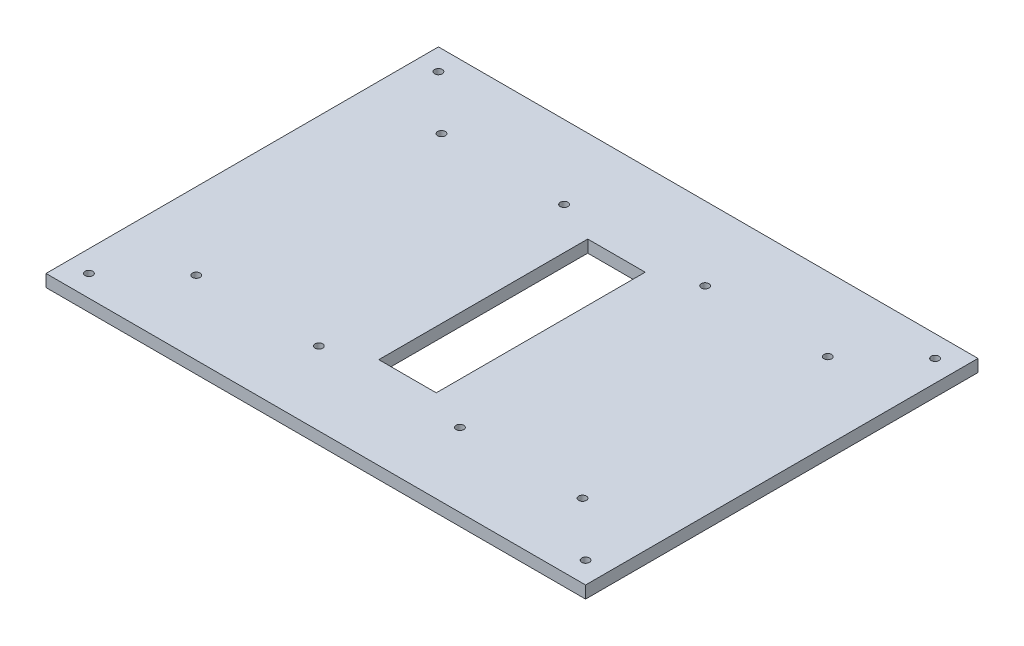
ISO-10303-21;
HEADER;
FILE_DESCRIPTION(('STEP AP214'),'2;1');
FILE_NAME('part.step','',(''),(''),'','','');
FILE_SCHEMA(('AUTOMOTIVE_DESIGN { 1 0 10303 214 1 1 1 1 }'));
ENDSEC;
DATA;
#1=APPLICATION_CONTEXT('core data for automotive mechanical design processes');
#2=APPLICATION_PROTOCOL_DEFINITION('international standard','automotive_design',2000,#1);
#3=PRODUCT_CONTEXT('',#1,'mechanical');
#4=PRODUCT('Part','Part','',(#3));
#5=PRODUCT_RELATED_PRODUCT_CATEGORY('part','',(#4));
#6=PRODUCT_DEFINITION_FORMATION('','',#4);
#7=PRODUCT_DEFINITION_CONTEXT('part definition',#1,'design');
#8=PRODUCT_DEFINITION('design','',#6,#7);
#9=PRODUCT_DEFINITION_SHAPE('','',#8);
#10=(LENGTH_UNIT() NAMED_UNIT(*) SI_UNIT(.MILLI.,.METRE.));
#11=(NAMED_UNIT(*) PLANE_ANGLE_UNIT() SI_UNIT($,.RADIAN.));
#12=(NAMED_UNIT(*) SI_UNIT($,.STERADIAN.) SOLID_ANGLE_UNIT());
#13=UNCERTAINTY_MEASURE_WITH_UNIT(LENGTH_MEASURE(1.E-05),#10,'distance_accuracy_value','');
#14=(GEOMETRIC_REPRESENTATION_CONTEXT(3) GLOBAL_UNCERTAINTY_ASSIGNED_CONTEXT((#13)) GLOBAL_UNIT_ASSIGNED_CONTEXT((#10,
#11,#12)) REPRESENTATION_CONTEXT('',''));
#15=CARTESIAN_POINT('',(0.,0.,0.));
#16=DIRECTION('',(0.,0.,1.));
#17=DIRECTION('',(1.,0.,0.));
#18=AXIS2_PLACEMENT_3D('',#15,#16,#17);
#19=CARTESIAN_POINT('',(0.,4.,0.));
#20=DIRECTION('',(0.,-1.,0.));
#21=DIRECTION('',(0.,0.,-1.));
#22=AXIS2_PLACEMENT_3D('',#19,#20,#21);
#23=PLANE('',#22);
#24=CARTESIAN_POINT('',(7.00000000000001,4.,-121.));
#25=DIRECTION('',(0.,1.,0.));
#26=DIRECTION('',(0.,0.,1.));
#27=AXIS2_PLACEMENT_3D('',#24,#25,#26);
#28=CIRCLE('',#27,1.24999999999999);
#29=CARTESIAN_POINT('',(7.00000000000001,4.,-119.75));
#30=VERTEX_POINT('',#29);
#31=EDGE_CURVE('E493',#30,#30,#28,.T.);
#32=ORIENTED_EDGE('',*,*,#31,.F.);
#33=EDGE_LOOP('',(#32));
#34=FACE_BOUND('',#33,.T.);
#35=CARTESIAN_POINT('',(7.00000000000001,4.,-7.00000000000003));
#36=DIRECTION('',(0.,1.,0.));
#37=DIRECTION('',(0.,0.,1.));
#38=AXIS2_PLACEMENT_3D('',#35,#36,#37);
#39=CIRCLE('',#38,1.24999999999999);
#40=CARTESIAN_POINT('',(7.00000000000001,4.,-5.75000000000005));
#41=VERTEX_POINT('',#40);
#42=EDGE_CURVE('E534',#41,#41,#39,.T.);
#43=ORIENTED_EDGE('',*,*,#42,.F.);
#44=EDGE_LOOP('',(#43));
#45=FACE_BOUND('',#44,.T.);
#46=CARTESIAN_POINT('',(151.,4.,-104.));
#47=DIRECTION('',(0.,1.,0.));
#48=DIRECTION('',(0.,0.,1.));
#49=AXIS2_PLACEMENT_3D('',#46,#47,#48);
#50=CIRCLE('',#49,1.24999999999997);
#51=CARTESIAN_POINT('',(151.,4.,-102.75));
#52=VERTEX_POINT('',#51);
#53=EDGE_CURVE('E566',#52,#52,#50,.T.);
#54=ORIENTED_EDGE('',*,*,#53,.F.);
#55=EDGE_LOOP('',(#54));
#56=FACE_BOUND('',#55,.T.);
#57=CARTESIAN_POINT('',(111.,4.,-104.));
#58=DIRECTION('',(0.,1.,0.));
#59=DIRECTION('',(0.,0.,1.));
#60=AXIS2_PLACEMENT_3D('',#57,#58,#59);
#61=CIRCLE('',#60,1.24999999999999);
#62=CARTESIAN_POINT('',(111.,4.,-102.75));
#63=VERTEX_POINT('',#62);
#64=EDGE_CURVE('E574',#63,#63,#61,.T.);
#65=ORIENTED_EDGE('',*,*,#64,.F.);
#66=EDGE_LOOP('',(#65));
#67=FACE_BOUND('',#66,.T.);
#68=CARTESIAN_POINT('',(169.,4.,-121.));
#69=DIRECTION('',(0.,1.,0.));
#70=DIRECTION('',(0.,0.,1.));
#71=AXIS2_PLACEMENT_3D('',#68,#69,#70);
#72=CIRCLE('',#71,1.24999999999997);
#73=CARTESIAN_POINT('',(169.,4.,-119.75));
#74=VERTEX_POINT('',#73);
#75=EDGE_CURVE('E581',#74,#74,#72,.T.);
#76=ORIENTED_EDGE('',*,*,#75,.F.);
#77=EDGE_LOOP('',(#76));
#78=FACE_BOUND('',#77,.T.);
#79=DIRECTION('',(1.,0.,0.));
#80=VECTOR('',#79,1.);
#81=CARTESIAN_POINT('',(78.6316655050712,4.,-29.9230665390979));
#82=LINE('',#81,#80);
#83=CARTESIAN_POINT('',(78.6316655050712,4.,-29.9230665390979));
#84=VERTEX_POINT('',#83);
#85=CARTESIAN_POINT('',(97.3683344949288,4.,-29.9230665390979));
#86=VERTEX_POINT('',#85);
#87=EDGE_CURVE('E146',#84,#86,#82,.T.);
#88=ORIENTED_EDGE('',*,*,#87,.F.);
#89=DIRECTION('',(0.,0.,1.));
#90=VECTOR('',#89,1.);
#91=CARTESIAN_POINT('',(78.6316655050712,4.,-98.0769334609021));
#92=LINE('',#91,#90);
#93=CARTESIAN_POINT('',(78.6316655050712,4.,-98.0769334609021));
#94=VERTEX_POINT('',#93);
#95=EDGE_CURVE('E59',#94,#84,#92,.T.);
#96=ORIENTED_EDGE('',*,*,#95,.F.);
#97=DIRECTION('',(-1.,0.,0.));
#98=VECTOR('',#97,1.);
#99=CARTESIAN_POINT('',(78.6316655050712,4.,-98.0769334609021));
#100=LINE('',#99,#98);
#101=CARTESIAN_POINT('',(97.3683344949288,4.,-98.0769334609021));
#102=VERTEX_POINT('',#101);
#103=EDGE_CURVE('E130',#102,#94,#100,.T.);
#104=ORIENTED_EDGE('',*,*,#103,.F.);
#105=DIRECTION('',(0.,0.,-1.));
#106=VECTOR('',#105,1.);
#107=CARTESIAN_POINT('',(97.3683344949288,4.,-98.0769334609021));
#108=LINE('',#107,#106);
#109=EDGE_CURVE('E134',#86,#102,#108,.T.);
#110=ORIENTED_EDGE('',*,*,#109,.F.);
#111=EDGE_LOOP('',(#88,#96,#104,#110));
#112=FACE_BOUND('',#111,.T.);
#113=DIRECTION('',(0.,0.,1.));
#114=VECTOR('',#113,1.);
#115=CARTESIAN_POINT('',(0.,4.,0.));
#116=LINE('',#115,#114);
#117=CARTESIAN_POINT('',(0.,4.,-128.));
#118=VERTEX_POINT('',#117);
#119=CARTESIAN_POINT('',(0.,4.,0.));
#120=VERTEX_POINT('',#119);
#121=EDGE_CURVE('E161',#118,#120,#116,.T.);
#122=ORIENTED_EDGE('',*,*,#121,.T.);
#123=DIRECTION('',(1.,0.,0.));
#124=VECTOR('',#123,1.);
#125=CARTESIAN_POINT('',(0.,4.,0.));
#126=LINE('',#125,#124);
#127=CARTESIAN_POINT('',(176.,4.,0.));
#128=VERTEX_POINT('',#127);
#129=EDGE_CURVE('E165',#120,#128,#126,.T.);
#130=ORIENTED_EDGE('',*,*,#129,.T.);
#131=DIRECTION('',(0.,0.,-1.));
#132=VECTOR('',#131,1.);
#133=CARTESIAN_POINT('',(176.,4.,0.));
#134=LINE('',#133,#132);
#135=CARTESIAN_POINT('',(176.,4.,-128.));
#136=VERTEX_POINT('',#135);
#137=EDGE_CURVE('E169',#128,#136,#134,.T.);
#138=ORIENTED_EDGE('',*,*,#137,.T.);
#139=DIRECTION('',(-1.,0.,0.));
#140=VECTOR('',#139,1.);
#141=CARTESIAN_POINT('',(0.,4.,-128.));
#142=LINE('',#141,#140);
#143=EDGE_CURVE('E172',#136,#118,#142,.T.);
#144=ORIENTED_EDGE('',*,*,#143,.T.);
#145=EDGE_LOOP('',(#122,#130,#138,#144));
#146=FACE_BOUND('',#145,.T.);
#147=CARTESIAN_POINT('',(151.,4.,-24.));
#148=DIRECTION('',(0.,1.,0.));
#149=DIRECTION('',(0.,0.,1.));
#150=AXIS2_PLACEMENT_3D('',#147,#148,#149);
#151=CIRCLE('',#150,1.24999999999997);
#152=CARTESIAN_POINT('',(151.,4.,-22.75));
#153=VERTEX_POINT('',#152);
#154=EDGE_CURVE('E558',#153,#153,#151,.T.);
#155=ORIENTED_EDGE('',*,*,#154,.F.);
#156=EDGE_LOOP('',(#155));
#157=FACE_BOUND('',#156,.T.);
#158=CARTESIAN_POINT('',(111.,4.,-24.));
#159=DIRECTION('',(0.,1.,0.));
#160=DIRECTION('',(0.,0.,1.));
#161=AXIS2_PLACEMENT_3D('',#158,#159,#160);
#162=CIRCLE('',#161,1.24999999999999);
#163=CARTESIAN_POINT('',(111.,4.,-22.75));
#164=VERTEX_POINT('',#163);
#165=EDGE_CURVE('E550',#164,#164,#162,.T.);
#166=ORIENTED_EDGE('',*,*,#165,.F.);
#167=EDGE_LOOP('',(#166));
#168=FACE_BOUND('',#167,.T.);
#169=CARTESIAN_POINT('',(169.,4.,-7.00000000000002));
#170=DIRECTION('',(0.,1.,0.));
#171=DIRECTION('',(0.,0.,1.));
#172=AXIS2_PLACEMENT_3D('',#169,#170,#171);
#173=CIRCLE('',#172,1.24999999999997);
#174=CARTESIAN_POINT('',(169.,4.,-5.75000000000005));
#175=VERTEX_POINT('',#174);
#176=EDGE_CURVE('E542',#175,#175,#173,.T.);
#177=ORIENTED_EDGE('',*,*,#176,.F.);
#178=EDGE_LOOP('',(#177));
#179=FACE_BOUND('',#178,.T.);
#180=CARTESIAN_POINT('',(25.,4.,-24.));
#181=DIRECTION('',(0.,1.,0.));
#182=DIRECTION('',(0.,0.,1.));
#183=AXIS2_PLACEMENT_3D('',#180,#181,#182);
#184=CIRCLE('',#183,1.24999999999999);
#185=CARTESIAN_POINT('',(25.,4.,-22.75));
#186=VERTEX_POINT('',#185);
#187=EDGE_CURVE('E526',#186,#186,#184,.T.);
#188=ORIENTED_EDGE('',*,*,#187,.F.);
#189=EDGE_LOOP('',(#188));
#190=FACE_BOUND('',#189,.T.);
#191=CARTESIAN_POINT('',(65.,4.,-24.));
#192=DIRECTION('',(0.,1.,0.));
#193=DIRECTION('',(0.,0.,1.));
#194=AXIS2_PLACEMENT_3D('',#191,#192,#193);
#195=CIRCLE('',#194,1.24999999999999);
#196=CARTESIAN_POINT('',(65.,4.,-22.75));
#197=VERTEX_POINT('',#196);
#198=EDGE_CURVE('E518',#197,#197,#195,.T.);
#199=ORIENTED_EDGE('',*,*,#198,.F.);
#200=EDGE_LOOP('',(#199));
#201=FACE_BOUND('',#200,.T.);
#202=CARTESIAN_POINT('',(65.,4.,-104.));
#203=DIRECTION('',(0.,1.,0.));
#204=DIRECTION('',(0.,0.,1.));
#205=AXIS2_PLACEMENT_3D('',#202,#203,#204);
#206=CIRCLE('',#205,1.24999999999999);
#207=CARTESIAN_POINT('',(65.,4.,-102.75));
#208=VERTEX_POINT('',#207);
#209=EDGE_CURVE('E510',#208,#208,#206,.T.);
#210=ORIENTED_EDGE('',*,*,#209,.F.);
#211=EDGE_LOOP('',(#210));
#212=FACE_BOUND('',#211,.T.);
#213=CARTESIAN_POINT('',(25.,4.,-104.));
#214=DIRECTION('',(0.,1.,0.));
#215=DIRECTION('',(0.,0.,1.));
#216=AXIS2_PLACEMENT_3D('',#213,#214,#215);
#217=CIRCLE('',#216,1.24999999999999);
#218=CARTESIAN_POINT('',(25.,4.,-102.75));
#219=VERTEX_POINT('',#218);
#220=EDGE_CURVE('E498',#219,#219,#217,.T.);
#221=ORIENTED_EDGE('',*,*,#220,.F.);
#222=EDGE_LOOP('',(#221));
#223=FACE_BOUND('',#222,.T.);
#224=ADVANCED_FACE('F43',(#34,#45,#56,#67,#78,#112,#146,#157,#168,#179,#190,#201,#212,#223),#23,.F.);
#225=CARTESIAN_POINT('',(0.,4.,0.));
#226=DIRECTION('',(1.,0.,0.));
#227=DIRECTION('',(0.,0.,-1.));
#228=AXIS2_PLACEMENT_3D('',#225,#226,#227);
#229=PLANE('',#228);
#230=DIRECTION('',(0.,0.,1.));
#231=VECTOR('',#230,1.);
#232=CARTESIAN_POINT('',(0.,0.,0.));
#233=LINE('',#232,#231);
#234=CARTESIAN_POINT('',(0.,0.,-128.));
#235=VERTEX_POINT('',#234);
#236=CARTESIAN_POINT('',(0.,0.,0.));
#237=VERTEX_POINT('',#236);
#238=EDGE_CURVE('E155',#235,#237,#233,.T.);
#239=ORIENTED_EDGE('',*,*,#238,.T.);
#240=DIRECTION('',(0.,-1.,0.));
#241=VECTOR('',#240,1.);
#242=CARTESIAN_POINT('',(0.,4.,0.));
#243=LINE('',#242,#241);
#244=EDGE_CURVE('E11',#120,#237,#243,.T.);
#245=ORIENTED_EDGE('',*,*,#244,.F.);
#246=ORIENTED_EDGE('',*,*,#121,.F.);
#247=DIRECTION('',(0.,-1.,0.));
#248=VECTOR('',#247,1.);
#249=CARTESIAN_POINT('',(0.,4.,-128.));
#250=LINE('',#249,#248);
#251=EDGE_CURVE('E175',#118,#235,#250,.T.);
#252=ORIENTED_EDGE('',*,*,#251,.T.);
#253=EDGE_LOOP('',(#239,#245,#246,#252));
#254=FACE_BOUND('',#253,.T.);
#255=ADVANCED_FACE('F45',(#254),#229,.F.);
#256=CARTESIAN_POINT('',(0.,4.,0.));
#257=DIRECTION('',(0.,0.,-1.));
#258=DIRECTION('',(-1.,0.,0.));
#259=AXIS2_PLACEMENT_3D('',#256,#257,#258);
#260=PLANE('',#259);
#261=DIRECTION('',(1.,0.,0.));
#262=VECTOR('',#261,1.);
#263=CARTESIAN_POINT('',(0.,0.,0.));
#264=LINE('',#263,#262);
#265=CARTESIAN_POINT('',(176.,0.,0.));
#266=VERTEX_POINT('',#265);
#267=EDGE_CURVE('E179',#237,#266,#264,.T.);
#268=ORIENTED_EDGE('',*,*,#267,.T.);
#269=DIRECTION('',(0.,-1.,0.));
#270=VECTOR('',#269,1.);
#271=CARTESIAN_POINT('',(176.,4.,0.));
#272=LINE('',#271,#270);
#273=EDGE_CURVE('E52',#128,#266,#272,.T.);
#274=ORIENTED_EDGE('',*,*,#273,.F.);
#275=ORIENTED_EDGE('',*,*,#129,.F.);
#276=ORIENTED_EDGE('',*,*,#244,.T.);
#277=EDGE_LOOP('',(#268,#274,#275,#276));
#278=FACE_BOUND('',#277,.T.);
#279=ADVANCED_FACE('F213',(#278),#260,.F.);
#280=CARTESIAN_POINT('',(176.,4.,0.));
#281=DIRECTION('',(-1.,0.,0.));
#282=DIRECTION('',(0.,0.,1.));
#283=AXIS2_PLACEMENT_3D('',#280,#281,#282);
#284=PLANE('',#283);
#285=DIRECTION('',(0.,0.,-1.));
#286=VECTOR('',#285,1.);
#287=CARTESIAN_POINT('',(176.,0.,0.));
#288=LINE('',#287,#286);
#289=CARTESIAN_POINT('',(176.,0.,-128.));
#290=VERTEX_POINT('',#289);
#291=EDGE_CURVE('E182',#266,#290,#288,.T.);
#292=ORIENTED_EDGE('',*,*,#291,.T.);
#293=DIRECTION('',(0.,-1.,0.));
#294=VECTOR('',#293,1.);
#295=CARTESIAN_POINT('',(176.,4.,-128.));
#296=LINE('',#295,#294);
#297=EDGE_CURVE('E190',#136,#290,#296,.T.);
#298=ORIENTED_EDGE('',*,*,#297,.F.);
#299=ORIENTED_EDGE('',*,*,#137,.F.);
#300=ORIENTED_EDGE('',*,*,#273,.T.);
#301=EDGE_LOOP('',(#292,#298,#299,#300));
#302=FACE_BOUND('',#301,.T.);
#303=ADVANCED_FACE('F199',(#302),#284,.F.);
#304=CARTESIAN_POINT('',(0.,4.,-128.));
#305=DIRECTION('',(0.,0.,1.));
#306=DIRECTION('',(1.,0.,0.));
#307=AXIS2_PLACEMENT_3D('',#304,#305,#306);
#308=PLANE('',#307);
#309=DIRECTION('',(-1.,0.,0.));
#310=VECTOR('',#309,1.);
#311=CARTESIAN_POINT('',(0.,0.,-128.));
#312=LINE('',#311,#310);
#313=EDGE_CURVE('E166',#290,#235,#312,.T.);
#314=ORIENTED_EDGE('',*,*,#313,.T.);
#315=ORIENTED_EDGE('',*,*,#251,.F.);
#316=ORIENTED_EDGE('',*,*,#143,.F.);
#317=ORIENTED_EDGE('',*,*,#297,.T.);
#318=EDGE_LOOP('',(#314,#315,#316,#317));
#319=FACE_BOUND('',#318,.T.);
#320=ADVANCED_FACE('F206',(#319),#308,.F.);
#321=CARTESIAN_POINT('',(0.,0.,0.));
#322=DIRECTION('',(0.,-1.,0.));
#323=DIRECTION('',(0.,0.,-1.));
#324=AXIS2_PLACEMENT_3D('',#321,#322,#323);
#325=PLANE('',#324);
#326=CARTESIAN_POINT('',(7.00000000000001,0.,-121.));
#327=DIRECTION('',(0.,-1.,0.));
#328=DIRECTION('',(0.,0.,-1.));
#329=AXIS2_PLACEMENT_3D('',#326,#327,#328);
#330=CIRCLE('',#329,1.24999999999999);
#331=CARTESIAN_POINT('',(7.00000000000001,0.,-122.25));
#332=VERTEX_POINT('',#331);
#333=EDGE_CURVE('E496',#332,#332,#330,.T.);
#334=ORIENTED_EDGE('',*,*,#333,.F.);
#335=EDGE_LOOP('',(#334));
#336=FACE_BOUND('',#335,.T.);
#337=CARTESIAN_POINT('',(25.,0.,-104.));
#338=DIRECTION('',(0.,-1.,0.));
#339=DIRECTION('',(0.,0.,-1.));
#340=AXIS2_PLACEMENT_3D('',#337,#338,#339);
#341=CIRCLE('',#340,1.24999999999999);
#342=CARTESIAN_POINT('',(25.,0.,-105.25));
#343=VERTEX_POINT('',#342);
#344=EDGE_CURVE('E503',#343,#343,#341,.T.);
#345=ORIENTED_EDGE('',*,*,#344,.F.);
#346=EDGE_LOOP('',(#345));
#347=FACE_BOUND('',#346,.T.);
#348=CARTESIAN_POINT('',(65.,0.,-104.));
#349=DIRECTION('',(0.,-1.,0.));
#350=DIRECTION('',(0.,0.,-1.));
#351=AXIS2_PLACEMENT_3D('',#348,#349,#350);
#352=CIRCLE('',#351,1.24999999999999);
#353=CARTESIAN_POINT('',(65.,0.,-105.25));
#354=VERTEX_POINT('',#353);
#355=EDGE_CURVE('E514',#354,#354,#352,.T.);
#356=ORIENTED_EDGE('',*,*,#355,.F.);
#357=EDGE_LOOP('',(#356));
#358=FACE_BOUND('',#357,.T.);
#359=CARTESIAN_POINT('',(65.,0.,-24.));
#360=DIRECTION('',(0.,-1.,0.));
#361=DIRECTION('',(0.,0.,-1.));
#362=AXIS2_PLACEMENT_3D('',#359,#360,#361);
#363=CIRCLE('',#362,1.24999999999999);
#364=CARTESIAN_POINT('',(65.,0.,-25.25));
#365=VERTEX_POINT('',#364);
#366=EDGE_CURVE('E522',#365,#365,#363,.T.);
#367=ORIENTED_EDGE('',*,*,#366,.F.);
#368=EDGE_LOOP('',(#367));
#369=FACE_BOUND('',#368,.T.);
#370=CARTESIAN_POINT('',(25.,0.,-24.));
#371=DIRECTION('',(0.,-1.,0.));
#372=DIRECTION('',(0.,0.,-1.));
#373=AXIS2_PLACEMENT_3D('',#370,#371,#372);
#374=CIRCLE('',#373,1.24999999999999);
#375=CARTESIAN_POINT('',(25.,0.,-25.25));
#376=VERTEX_POINT('',#375);
#377=EDGE_CURVE('E530',#376,#376,#374,.T.);
#378=ORIENTED_EDGE('',*,*,#377,.F.);
#379=EDGE_LOOP('',(#378));
#380=FACE_BOUND('',#379,.T.);
#381=CARTESIAN_POINT('',(7.00000000000001,0.,-7.00000000000003));
#382=DIRECTION('',(0.,-1.,0.));
#383=DIRECTION('',(0.,0.,-1.));
#384=AXIS2_PLACEMENT_3D('',#381,#382,#383);
#385=CIRCLE('',#384,1.24999999999999);
#386=CARTESIAN_POINT('',(7.00000000000001,0.,-8.25000000000003));
#387=VERTEX_POINT('',#386);
#388=EDGE_CURVE('E538',#387,#387,#385,.T.);
#389=ORIENTED_EDGE('',*,*,#388,.F.);
#390=EDGE_LOOP('',(#389));
#391=FACE_BOUND('',#390,.T.);
#392=CARTESIAN_POINT('',(169.,0.,-7.00000000000002));
#393=DIRECTION('',(0.,-1.,0.));
#394=DIRECTION('',(0.,0.,-1.));
#395=AXIS2_PLACEMENT_3D('',#392,#393,#394);
#396=CIRCLE('',#395,1.24999999999999);
#397=CARTESIAN_POINT('',(169.,0.,-8.25000000000001));
#398=VERTEX_POINT('',#397);
#399=EDGE_CURVE('E546',#398,#398,#396,.T.);
#400=ORIENTED_EDGE('',*,*,#399,.F.);
#401=EDGE_LOOP('',(#400));
#402=FACE_BOUND('',#401,.T.);
#403=CARTESIAN_POINT('',(111.,0.,-24.));
#404=DIRECTION('',(0.,-1.,0.));
#405=DIRECTION('',(0.,0.,-1.));
#406=AXIS2_PLACEMENT_3D('',#403,#404,#405);
#407=CIRCLE('',#406,1.24999999999999);
#408=CARTESIAN_POINT('',(111.,0.,-25.25));
#409=VERTEX_POINT('',#408);
#410=EDGE_CURVE('E554',#409,#409,#407,.T.);
#411=ORIENTED_EDGE('',*,*,#410,.F.);
#412=EDGE_LOOP('',(#411));
#413=FACE_BOUND('',#412,.T.);
#414=CARTESIAN_POINT('',(151.,0.,-24.));
#415=DIRECTION('',(0.,-1.,0.));
#416=DIRECTION('',(0.,0.,-1.));
#417=AXIS2_PLACEMENT_3D('',#414,#415,#416);
#418=CIRCLE('',#417,1.24999999999999);
#419=CARTESIAN_POINT('',(151.,0.,-25.25));
#420=VERTEX_POINT('',#419);
#421=EDGE_CURVE('E562',#420,#420,#418,.T.);
#422=ORIENTED_EDGE('',*,*,#421,.F.);
#423=EDGE_LOOP('',(#422));
#424=FACE_BOUND('',#423,.T.);
#425=CARTESIAN_POINT('',(151.,0.,-104.));
#426=DIRECTION('',(0.,-1.,0.));
#427=DIRECTION('',(0.,0.,-1.));
#428=AXIS2_PLACEMENT_3D('',#425,#426,#427);
#429=CIRCLE('',#428,1.24999999999999);
#430=CARTESIAN_POINT('',(151.,0.,-105.25));
#431=VERTEX_POINT('',#430);
#432=EDGE_CURVE('E570',#431,#431,#429,.T.);
#433=ORIENTED_EDGE('',*,*,#432,.F.);
#434=EDGE_LOOP('',(#433));
#435=FACE_BOUND('',#434,.T.);
#436=CARTESIAN_POINT('',(111.,0.,-104.));
#437=DIRECTION('',(0.,-1.,0.));
#438=DIRECTION('',(0.,0.,-1.));
#439=AXIS2_PLACEMENT_3D('',#436,#437,#438);
#440=CIRCLE('',#439,1.24999999999999);
#441=CARTESIAN_POINT('',(111.,0.,-105.25));
#442=VERTEX_POINT('',#441);
#443=EDGE_CURVE('E578',#442,#442,#440,.T.);
#444=ORIENTED_EDGE('',*,*,#443,.F.);
#445=EDGE_LOOP('',(#444));
#446=FACE_BOUND('',#445,.T.);
#447=CARTESIAN_POINT('',(169.,0.,-121.));
#448=DIRECTION('',(0.,-1.,0.));
#449=DIRECTION('',(0.,0.,-1.));
#450=AXIS2_PLACEMENT_3D('',#447,#448,#449);
#451=CIRCLE('',#450,1.24999999999999);
#452=CARTESIAN_POINT('',(169.,0.,-122.25));
#453=VERTEX_POINT('',#452);
#454=EDGE_CURVE('E137',#453,#453,#451,.T.);
#455=ORIENTED_EDGE('',*,*,#454,.F.);
#456=EDGE_LOOP('',(#455));
#457=FACE_BOUND('',#456,.T.);
#458=DIRECTION('',(0.,0.,1.));
#459=VECTOR('',#458,1.);
#460=CARTESIAN_POINT('',(78.6316655050712,0.,-98.0769334609021));
#461=LINE('',#460,#459);
#462=CARTESIAN_POINT('',(78.6316655050712,0.,-98.0769334609021));
#463=VERTEX_POINT('',#462);
#464=CARTESIAN_POINT('',(78.6316655050712,0.,-29.9230665390979));
#465=VERTEX_POINT('',#464);
#466=EDGE_CURVE('E111',#463,#465,#461,.T.);
#467=ORIENTED_EDGE('',*,*,#466,.T.);
#468=DIRECTION('',(1.,0.,0.));
#469=VECTOR('',#468,1.);
#470=CARTESIAN_POINT('',(78.6316655050712,0.,-29.9230665390979));
#471=LINE('',#470,#469);
#472=CARTESIAN_POINT('',(97.3683344949288,0.,-29.9230665390979));
#473=VERTEX_POINT('',#472);
#474=EDGE_CURVE('E121',#465,#473,#471,.T.);
#475=ORIENTED_EDGE('',*,*,#474,.T.);
#476=DIRECTION('',(0.,0.,-1.));
#477=VECTOR('',#476,1.);
#478=CARTESIAN_POINT('',(97.3683344949288,0.,-98.0769334609021));
#479=LINE('',#478,#477);
#480=CARTESIAN_POINT('',(97.3683344949288,0.,-98.0769334609021));
#481=VERTEX_POINT('',#480);
#482=EDGE_CURVE('E67',#473,#481,#479,.T.);
#483=ORIENTED_EDGE('',*,*,#482,.T.);
#484=DIRECTION('',(-1.,0.,0.));
#485=VECTOR('',#484,1.);
#486=CARTESIAN_POINT('',(78.6316655050712,0.,-98.0769334609021));
#487=LINE('',#486,#485);
#488=EDGE_CURVE('E118',#481,#463,#487,.T.);
#489=ORIENTED_EDGE('',*,*,#488,.T.);
#490=EDGE_LOOP('',(#467,#475,#483,#489));
#491=FACE_BOUND('',#490,.T.);
#492=ORIENTED_EDGE('',*,*,#238,.F.);
#493=ORIENTED_EDGE('',*,*,#313,.F.);
#494=ORIENTED_EDGE('',*,*,#291,.F.);
#495=ORIENTED_EDGE('',*,*,#267,.F.);
#496=EDGE_LOOP('',(#492,#493,#494,#495));
#497=FACE_BOUND('',#496,.T.);
#498=ADVANCED_FACE('F126',(#336,#347,#358,#369,#380,#391,#402,#413,#424,#435,#446,#457,#491,
#497),#325,.T.);
#499=CARTESIAN_POINT('',(78.6316655050712,0.,-98.0769334609021));
#500=DIRECTION('',(-1.,0.,0.));
#501=DIRECTION('',(0.,0.,1.));
#502=AXIS2_PLACEMENT_3D('',#499,#500,#501);
#503=PLANE('',#502);
#504=ORIENTED_EDGE('',*,*,#95,.T.);
#505=DIRECTION('',(0.,1.,0.));
#506=VECTOR('',#505,1.);
#507=CARTESIAN_POINT('',(78.6316655050712,0.,-29.9230665390979));
#508=LINE('',#507,#506);
#509=EDGE_CURVE('E107',#465,#84,#508,.T.);
#510=ORIENTED_EDGE('',*,*,#509,.F.);
#511=ORIENTED_EDGE('',*,*,#466,.F.);
#512=DIRECTION('',(0.,1.,0.));
#513=VECTOR('',#512,1.);
#514=CARTESIAN_POINT('',(78.6316655050712,0.,-98.0769334609021));
#515=LINE('',#514,#513);
#516=EDGE_CURVE('E152',#463,#94,#515,.T.);
#517=ORIENTED_EDGE('',*,*,#516,.T.);
#518=EDGE_LOOP('',(#504,#510,#511,#517));
#519=FACE_BOUND('',#518,.T.);
#520=ADVANCED_FACE('F109',(#519),#503,.F.);
#521=CARTESIAN_POINT('',(78.6316655050712,0.,-98.0769334609021));
#522=DIRECTION('',(0.,0.,-1.));
#523=DIRECTION('',(-1.,0.,0.));
#524=AXIS2_PLACEMENT_3D('',#521,#522,#523);
#525=PLANE('',#524);
#526=ORIENTED_EDGE('',*,*,#103,.T.);
#527=ORIENTED_EDGE('',*,*,#516,.F.);
#528=ORIENTED_EDGE('',*,*,#488,.F.);
#529=DIRECTION('',(0.,1.,0.));
#530=VECTOR('',#529,1.);
#531=CARTESIAN_POINT('',(97.3683344949288,0.,-98.0769334609021));
#532=LINE('',#531,#530);
#533=EDGE_CURVE('E156',#481,#102,#532,.T.);
#534=ORIENTED_EDGE('',*,*,#533,.T.);
#535=EDGE_LOOP('',(#526,#527,#528,#534));
#536=FACE_BOUND('',#535,.T.);
#537=ADVANCED_FACE('F250',(#536),#525,.F.);
#538=CARTESIAN_POINT('',(97.3683344949288,0.,-98.0769334609021));
#539=DIRECTION('',(1.,0.,0.));
#540=DIRECTION('',(0.,0.,-1.));
#541=AXIS2_PLACEMENT_3D('',#538,#539,#540);
#542=PLANE('',#541);
#543=ORIENTED_EDGE('',*,*,#109,.T.);
#544=ORIENTED_EDGE('',*,*,#533,.F.);
#545=ORIENTED_EDGE('',*,*,#482,.F.);
#546=DIRECTION('',(0.,1.,0.));
#547=VECTOR('',#546,1.);
#548=CARTESIAN_POINT('',(97.3683344949288,0.,-29.9230665390979));
#549=LINE('',#548,#547);
#550=EDGE_CURVE('E117',#473,#86,#549,.T.);
#551=ORIENTED_EDGE('',*,*,#550,.T.);
#552=EDGE_LOOP('',(#543,#544,#545,#551));
#553=FACE_BOUND('',#552,.T.);
#554=ADVANCED_FACE('F256',(#553),#542,.F.);
#555=CARTESIAN_POINT('',(78.6316655050712,0.,-29.9230665390979));
#556=DIRECTION('',(0.,0.,1.));
#557=DIRECTION('',(1.,0.,0.));
#558=AXIS2_PLACEMENT_3D('',#555,#556,#557);
#559=PLANE('',#558);
#560=ORIENTED_EDGE('',*,*,#87,.T.);
#561=ORIENTED_EDGE('',*,*,#550,.F.);
#562=ORIENTED_EDGE('',*,*,#474,.F.);
#563=ORIENTED_EDGE('',*,*,#509,.T.);
#564=EDGE_LOOP('',(#560,#561,#562,#563));
#565=FACE_BOUND('',#564,.T.);
#566=ADVANCED_FACE('F122',(#565),#559,.F.);
#567=CARTESIAN_POINT('',(169.,4.,-121.));
#568=DIRECTION('',(0.,1.,0.));
#569=DIRECTION('',(0.,0.,1.));
#570=AXIS2_PLACEMENT_3D('',#567,#568,#569);
#571=CYLINDRICAL_SURFACE('',#570,1.24999999999999);
#572=ORIENTED_EDGE('',*,*,#75,.T.);
#573=EDGE_LOOP('',(#572));
#574=FACE_BOUND('',#573,.T.);
#575=ORIENTED_EDGE('',*,*,#454,.T.);
#576=EDGE_LOOP('',(#575));
#577=FACE_BOUND('',#576,.T.);
#578=ADVANCED_FACE('F270',(#574,#577),#571,.F.);
#579=CARTESIAN_POINT('',(111.,4.,-104.));
#580=DIRECTION('',(0.,1.,0.));
#581=DIRECTION('',(0.,0.,1.));
#582=AXIS2_PLACEMENT_3D('',#579,#580,#581);
#583=CYLINDRICAL_SURFACE('',#582,1.24999999999999);
#584=ORIENTED_EDGE('',*,*,#64,.T.);
#585=EDGE_LOOP('',(#584));
#586=FACE_BOUND('',#585,.T.);
#587=ORIENTED_EDGE('',*,*,#443,.T.);
#588=EDGE_LOOP('',(#587));
#589=FACE_BOUND('',#588,.T.);
#590=ADVANCED_FACE('F276',(#586,#589),#583,.F.);
#591=CARTESIAN_POINT('',(151.,4.,-104.));
#592=DIRECTION('',(0.,1.,0.));
#593=DIRECTION('',(0.,0.,1.));
#594=AXIS2_PLACEMENT_3D('',#591,#592,#593);
#595=CYLINDRICAL_SURFACE('',#594,1.24999999999999);
#596=ORIENTED_EDGE('',*,*,#53,.T.);
#597=EDGE_LOOP('',(#596));
#598=FACE_BOUND('',#597,.T.);
#599=ORIENTED_EDGE('',*,*,#432,.T.);
#600=EDGE_LOOP('',(#599));
#601=FACE_BOUND('',#600,.T.);
#602=ADVANCED_FACE('F285',(#598,#601),#595,.F.);
#603=CARTESIAN_POINT('',(151.,4.,-24.));
#604=DIRECTION('',(0.,1.,0.));
#605=DIRECTION('',(0.,0.,1.));
#606=AXIS2_PLACEMENT_3D('',#603,#604,#605);
#607=CYLINDRICAL_SURFACE('',#606,1.24999999999999);
#608=ORIENTED_EDGE('',*,*,#154,.T.);
#609=EDGE_LOOP('',(#608));
#610=FACE_BOUND('',#609,.T.);
#611=ORIENTED_EDGE('',*,*,#421,.T.);
#612=EDGE_LOOP('',(#611));
#613=FACE_BOUND('',#612,.T.);
#614=ADVANCED_FACE('F294',(#610,#613),#607,.F.);
#615=CARTESIAN_POINT('',(111.,4.,-24.));
#616=DIRECTION('',(0.,1.,0.));
#617=DIRECTION('',(0.,0.,1.));
#618=AXIS2_PLACEMENT_3D('',#615,#616,#617);
#619=CYLINDRICAL_SURFACE('',#618,1.24999999999999);
#620=ORIENTED_EDGE('',*,*,#165,.T.);
#621=EDGE_LOOP('',(#620));
#622=FACE_BOUND('',#621,.T.);
#623=ORIENTED_EDGE('',*,*,#410,.T.);
#624=EDGE_LOOP('',(#623));
#625=FACE_BOUND('',#624,.T.);
#626=ADVANCED_FACE('F303',(#622,#625),#619,.F.);
#627=CARTESIAN_POINT('',(169.,4.,-7.00000000000002));
#628=DIRECTION('',(0.,1.,0.));
#629=DIRECTION('',(0.,0.,1.));
#630=AXIS2_PLACEMENT_3D('',#627,#628,#629);
#631=CYLINDRICAL_SURFACE('',#630,1.24999999999999);
#632=ORIENTED_EDGE('',*,*,#176,.T.);
#633=EDGE_LOOP('',(#632));
#634=FACE_BOUND('',#633,.T.);
#635=ORIENTED_EDGE('',*,*,#399,.T.);
#636=EDGE_LOOP('',(#635));
#637=FACE_BOUND('',#636,.T.);
#638=ADVANCED_FACE('F312',(#634,#637),#631,.F.);
#639=CARTESIAN_POINT('',(7.00000000000001,4.,-7.00000000000003));
#640=DIRECTION('',(0.,1.,0.));
#641=DIRECTION('',(0.,0.,1.));
#642=AXIS2_PLACEMENT_3D('',#639,#640,#641);
#643=CYLINDRICAL_SURFACE('',#642,1.24999999999999);
#644=ORIENTED_EDGE('',*,*,#42,.T.);
#645=EDGE_LOOP('',(#644));
#646=FACE_BOUND('',#645,.T.);
#647=ORIENTED_EDGE('',*,*,#388,.T.);
#648=EDGE_LOOP('',(#647));
#649=FACE_BOUND('',#648,.T.);
#650=ADVANCED_FACE('F321',(#646,#649),#643,.F.);
#651=CARTESIAN_POINT('',(25.,4.,-24.));
#652=DIRECTION('',(0.,1.,0.));
#653=DIRECTION('',(0.,0.,1.));
#654=AXIS2_PLACEMENT_3D('',#651,#652,#653);
#655=CYLINDRICAL_SURFACE('',#654,1.24999999999999);
#656=ORIENTED_EDGE('',*,*,#187,.T.);
#657=EDGE_LOOP('',(#656));
#658=FACE_BOUND('',#657,.T.);
#659=ORIENTED_EDGE('',*,*,#377,.T.);
#660=EDGE_LOOP('',(#659));
#661=FACE_BOUND('',#660,.T.);
#662=ADVANCED_FACE('F330',(#658,#661),#655,.F.);
#663=CARTESIAN_POINT('',(65.,4.,-24.));
#664=DIRECTION('',(0.,1.,0.));
#665=DIRECTION('',(0.,0.,1.));
#666=AXIS2_PLACEMENT_3D('',#663,#664,#665);
#667=CYLINDRICAL_SURFACE('',#666,1.24999999999999);
#668=ORIENTED_EDGE('',*,*,#198,.T.);
#669=EDGE_LOOP('',(#668));
#670=FACE_BOUND('',#669,.T.);
#671=ORIENTED_EDGE('',*,*,#366,.T.);
#672=EDGE_LOOP('',(#671));
#673=FACE_BOUND('',#672,.T.);
#674=ADVANCED_FACE('F339',(#670,#673),#667,.F.);
#675=CARTESIAN_POINT('',(65.,4.,-104.));
#676=DIRECTION('',(0.,1.,0.));
#677=DIRECTION('',(0.,0.,1.));
#678=AXIS2_PLACEMENT_3D('',#675,#676,#677);
#679=CYLINDRICAL_SURFACE('',#678,1.24999999999999);
#680=ORIENTED_EDGE('',*,*,#209,.T.);
#681=EDGE_LOOP('',(#680));
#682=FACE_BOUND('',#681,.T.);
#683=ORIENTED_EDGE('',*,*,#355,.T.);
#684=EDGE_LOOP('',(#683));
#685=FACE_BOUND('',#684,.T.);
#686=ADVANCED_FACE('F348',(#682,#685),#679,.F.);
#687=CARTESIAN_POINT('',(25.,4.,-104.));
#688=DIRECTION('',(0.,1.,0.));
#689=DIRECTION('',(0.,0.,1.));
#690=AXIS2_PLACEMENT_3D('',#687,#688,#689);
#691=CYLINDRICAL_SURFACE('',#690,1.24999999999999);
#692=ORIENTED_EDGE('',*,*,#220,.T.);
#693=EDGE_LOOP('',(#692));
#694=FACE_BOUND('',#693,.T.);
#695=ORIENTED_EDGE('',*,*,#344,.T.);
#696=EDGE_LOOP('',(#695));
#697=FACE_BOUND('',#696,.T.);
#698=ADVANCED_FACE('F357',(#694,#697),#691,.F.);
#699=CARTESIAN_POINT('',(7.00000000000001,4.,-121.));
#700=DIRECTION('',(0.,1.,0.));
#701=DIRECTION('',(0.,0.,1.));
#702=AXIS2_PLACEMENT_3D('',#699,#700,#701);
#703=CYLINDRICAL_SURFACE('',#702,1.24999999999999);
#704=ORIENTED_EDGE('',*,*,#31,.T.);
#705=EDGE_LOOP('',(#704));
#706=FACE_BOUND('',#705,.T.);
#707=ORIENTED_EDGE('',*,*,#333,.T.);
#708=EDGE_LOOP('',(#707));
#709=FACE_BOUND('',#708,.T.);
#710=ADVANCED_FACE('F366',(#706,#709),#703,.F.);
#711=CLOSED_SHELL('',(#224,#255,#279,#303,#320,#498,#520,#537,#554,#566,#578,#590,#602,#614,
#626,#638,#650,#662,#674,#686,#698,#710));
#712=MANIFOLD_SOLID_BREP('B2',#711);
#713=ADVANCED_BREP_SHAPE_REPRESENTATION('',(#18,#712),#14);
#714=SHAPE_DEFINITION_REPRESENTATION(#9,#713);
ENDSEC;
END-ISO-10303-21;
